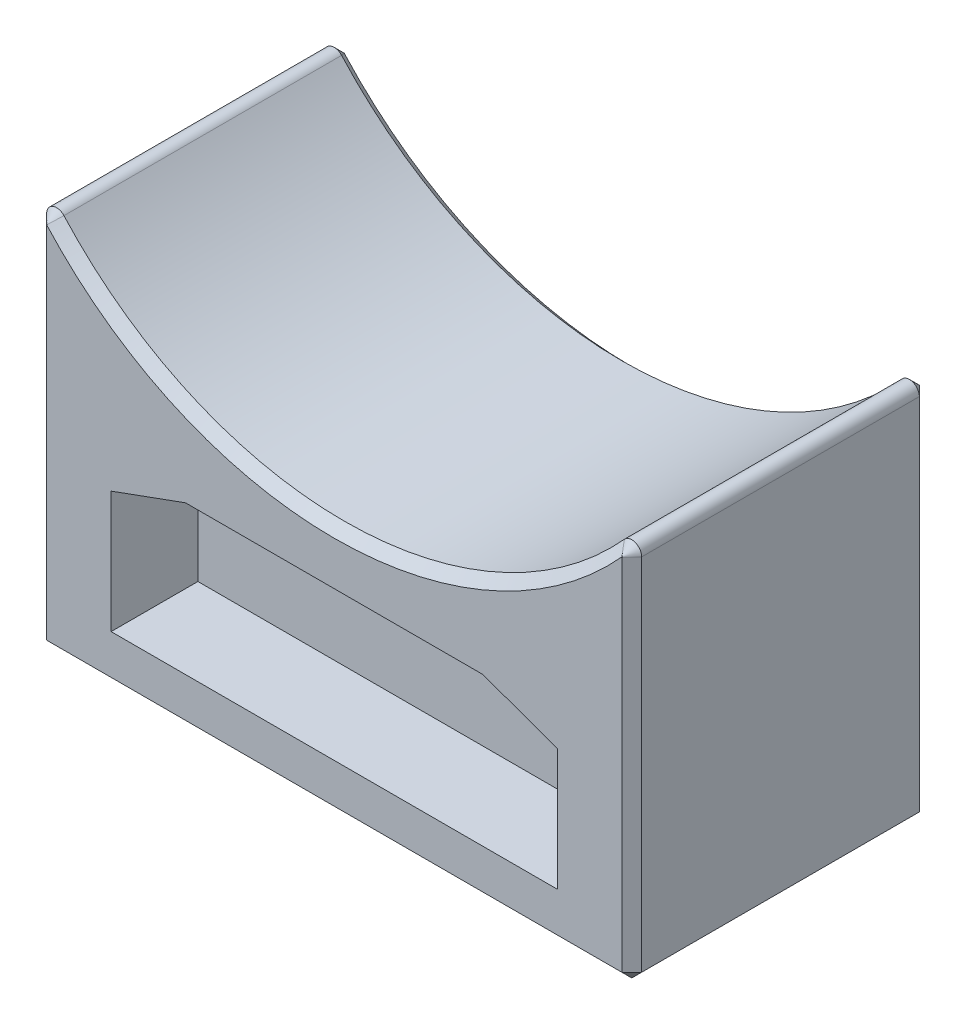
ISO-10303-21;
HEADER;
FILE_DESCRIPTION(('STEP AP214'),'2;1');
FILE_NAME('part.step','',(''),(''),'','','');
FILE_SCHEMA(('AUTOMOTIVE_DESIGN { 1 0 10303 214 1 1 1 1 }'));
ENDSEC;
DATA;
#1=APPLICATION_CONTEXT('core data for automotive mechanical design processes');
#2=APPLICATION_PROTOCOL_DEFINITION('international standard','automotive_design',2000,#1);
#3=PRODUCT_CONTEXT('',#1,'mechanical');
#4=PRODUCT('Part','Part','',(#3));
#5=PRODUCT_RELATED_PRODUCT_CATEGORY('part','',(#4));
#6=PRODUCT_DEFINITION_FORMATION('','',#4);
#7=PRODUCT_DEFINITION_CONTEXT('part definition',#1,'design');
#8=PRODUCT_DEFINITION('design','',#6,#7);
#9=PRODUCT_DEFINITION_SHAPE('','',#8);
#10=(LENGTH_UNIT() NAMED_UNIT(*) SI_UNIT(.MILLI.,.METRE.));
#11=(NAMED_UNIT(*) PLANE_ANGLE_UNIT() SI_UNIT($,.RADIAN.));
#12=(NAMED_UNIT(*) SI_UNIT($,.STERADIAN.) SOLID_ANGLE_UNIT());
#13=UNCERTAINTY_MEASURE_WITH_UNIT(LENGTH_MEASURE(1.E-05),#10,'distance_accuracy_value','');
#14=(GEOMETRIC_REPRESENTATION_CONTEXT(3) GLOBAL_UNCERTAINTY_ASSIGNED_CONTEXT((#13)) GLOBAL_UNIT_ASSIGNED_CONTEXT((#10,
#11,#12)) REPRESENTATION_CONTEXT('',''));
#15=CARTESIAN_POINT('',(0.,0.,0.));
#16=DIRECTION('',(0.,0.,1.));
#17=DIRECTION('',(1.,0.,0.));
#18=AXIS2_PLACEMENT_3D('',#15,#16,#17);
#19=CARTESIAN_POINT('',(0.,0.,60.));
#20=DIRECTION('',(0.,0.,-1.));
#21=DIRECTION('',(-1.,0.,0.));
#22=AXIS2_PLACEMENT_3D('',#19,#20,#21);
#23=PLANE('',#22);
#24=DIRECTION('',(0.,-1.,0.));
#25=VECTOR('',#24,1.);
#26=CARTESIAN_POINT('',(-58.,-127.,60.));
#27=LINE('',#26,#25);
#28=CARTESIAN_POINT('',(-58.,-52.4522640121473,60.));
#29=VERTEX_POINT('',#28);
#30=CARTESIAN_POINT('',(-58.,-125.,60.));
#31=VERTEX_POINT('',#30);
#32=EDGE_CURVE('E327',#29,#31,#27,.T.);
#33=ORIENTED_EDGE('',*,*,#32,.T.);
#34=DIRECTION('',(1.,0.,0.));
#35=VECTOR('',#34,1.);
#36=CARTESIAN_POINT('',(0.,-125.,60.));
#37=LINE('',#36,#35);
#38=CARTESIAN_POINT('',(58.,-125.,60.));
#39=VERTEX_POINT('',#38);
#40=EDGE_CURVE('E329',#31,#39,#37,.T.);
#41=ORIENTED_EDGE('',*,*,#40,.T.);
#42=DIRECTION('',(0.,1.,0.));
#43=VECTOR('',#42,1.);
#44=CARTESIAN_POINT('',(58.,0.,60.));
#45=LINE('',#44,#43);
#46=CARTESIAN_POINT('',(58.,-52.4522640121473,60.));
#47=VERTEX_POINT('',#46);
#48=EDGE_CURVE('E323',#39,#47,#45,.T.);
#49=ORIENTED_EDGE('',*,*,#48,.T.);
#50=CARTESIAN_POINT('',(0.,0.,60.));
#51=DIRECTION('',(0.,0.,-1.));
#52=DIRECTION('',(-1.,0.,0.));
#53=AXIS2_PLACEMENT_3D('',#50,#51,#52);
#54=CIRCLE('',#53,78.2);
#55=EDGE_CURVE('E325',#47,#29,#54,.T.);
#56=ORIENTED_EDGE('',*,*,#55,.T.);
#57=EDGE_LOOP('',(#33,#41,#49,#56));
#58=FACE_BOUND('',#57,.T.);
#59=DIRECTION('',(0.,1.,0.));
#60=VECTOR('',#59,1.);
#61=CARTESIAN_POINT('',(-45.,-117.,60.));
#62=LINE('',#61,#60);
#63=CARTESIAN_POINT('',(-45.,-117.,60.));
#64=VERTEX_POINT('',#63);
#65=CARTESIAN_POINT('',(-45.,-92.4595535139931,60.));
#66=VERTEX_POINT('',#65);
#67=EDGE_CURVE('E224',#64,#66,#62,.T.);
#68=ORIENTED_EDGE('',*,*,#67,.T.);
#69=DIRECTION('',(-0.939692620785907,-0.342020143325673,0.));
#70=VECTOR('',#69,1.);
#71=CARTESIAN_POINT('',(24.4519276681494,-67.181119130377,60.));
#72=LINE('',#71,#70);
#73=CARTESIAN_POINT('',(-30.0000000000001,-87.,60.));
#74=VERTEX_POINT('',#73);
#75=EDGE_CURVE('E51',#66,#74,#72,.F.);
#76=ORIENTED_EDGE('',*,*,#75,.T.);
#77=DIRECTION('',(1.,0.,0.));
#78=VECTOR('',#77,1.);
#79=CARTESIAN_POINT('',(-45.,-87.,60.));
#80=LINE('',#79,#78);
#81=CARTESIAN_POINT('',(30.0000000000001,-87.,60.));
#82=VERTEX_POINT('',#81);
#83=EDGE_CURVE('E229',#74,#82,#80,.T.);
#84=ORIENTED_EDGE('',*,*,#83,.T.);
#85=DIRECTION('',(-0.939692620785907,0.342020143325673,0.));
#86=VECTOR('',#85,1.);
#87=CARTESIAN_POINT('',(-24.4519276681494,-67.181119130377,60.));
#88=LINE('',#87,#86);
#89=CARTESIAN_POINT('',(45.,-92.4595535139931,60.));
#90=VERTEX_POINT('',#89);
#91=EDGE_CURVE('E11',#82,#90,#88,.F.);
#92=ORIENTED_EDGE('',*,*,#91,.T.);
#93=DIRECTION('',(0.,-1.,0.));
#94=VECTOR('',#93,1.);
#95=CARTESIAN_POINT('',(45.,-117.,60.));
#96=LINE('',#95,#94);
#97=CARTESIAN_POINT('',(45.,-117.,60.));
#98=VERTEX_POINT('',#97);
#99=EDGE_CURVE('E231',#90,#98,#96,.T.);
#100=ORIENTED_EDGE('',*,*,#99,.T.);
#101=DIRECTION('',(-1.,0.,0.));
#102=VECTOR('',#101,1.);
#103=CARTESIAN_POINT('',(-45.,-117.,60.));
#104=LINE('',#103,#102);
#105=EDGE_CURVE('E236',#98,#64,#104,.T.);
#106=ORIENTED_EDGE('',*,*,#105,.T.);
#107=EDGE_LOOP('',(#68,#76,#84,#92,#100,#106));
#108=FACE_BOUND('',#107,.T.);
#109=ADVANCED_FACE('F41',(#58,#108),#23,.F.);
#110=CARTESIAN_POINT('',(0.,-127.,60.));
#111=DIRECTION('',(0.,1.,0.));
#112=DIRECTION('',(0.,0.,1.));
#113=AXIS2_PLACEMENT_3D('',#110,#111,#112);
#114=PLANE('',#113);
#115=DIRECTION('',(-1.,0.,0.));
#116=VECTOR('',#115,1.);
#117=CARTESIAN_POINT('',(0.,-127.,58.));
#118=LINE('',#117,#116);
#119=CARTESIAN_POINT('',(58.,-127.,58.));
#120=VERTEX_POINT('',#119);
#121=CARTESIAN_POINT('',(-58.,-127.,58.));
#122=VERTEX_POINT('',#121);
#123=EDGE_CURVE('E280',#120,#122,#118,.T.);
#124=ORIENTED_EDGE('',*,*,#123,.T.);
#125=DIRECTION('',(0.,0.,-1.));
#126=VECTOR('',#125,1.);
#127=CARTESIAN_POINT('',(-58.,-127.,0.));
#128=LINE('',#127,#126);
#129=CARTESIAN_POINT('',(-58.,-127.,1.99999999999999));
#130=VERTEX_POINT('',#129);
#131=EDGE_CURVE('E286',#122,#130,#128,.T.);
#132=ORIENTED_EDGE('',*,*,#131,.T.);
#133=DIRECTION('',(1.,0.,0.));
#134=VECTOR('',#133,1.);
#135=CARTESIAN_POINT('',(60.,-127.,1.99999999999999));
#136=LINE('',#135,#134);
#137=CARTESIAN_POINT('',(58.,-127.,1.99999999999999));
#138=VERTEX_POINT('',#137);
#139=EDGE_CURVE('E284',#130,#138,#136,.T.);
#140=ORIENTED_EDGE('',*,*,#139,.T.);
#141=DIRECTION('',(0.,0.,1.));
#142=VECTOR('',#141,1.);
#143=CARTESIAN_POINT('',(58.,-127.,60.));
#144=LINE('',#143,#142);
#145=EDGE_CURVE('E282',#138,#120,#144,.T.);
#146=ORIENTED_EDGE('',*,*,#145,.T.);
#147=EDGE_LOOP('',(#124,#132,#140,#146));
#148=FACE_BOUND('',#147,.T.);
#149=ADVANCED_FACE('F441',(#148),#114,.F.);
#150=CARTESIAN_POINT('',(60.,-127.,60.));
#151=DIRECTION('',(-1.,0.,0.));
#152=DIRECTION('',(0.,0.,1.));
#153=AXIS2_PLACEMENT_3D('',#150,#151,#152);
#154=PLANE('',#153);
#155=DIRECTION('',(0.,0.,-1.));
#156=VECTOR('',#155,1.);
#157=CARTESIAN_POINT('',(60.,-125.,60.));
#158=LINE('',#157,#156);
#159=CARTESIAN_POINT('',(60.,-125.,58.));
#160=VERTEX_POINT('',#159);
#161=CARTESIAN_POINT('',(60.,-125.,1.99999999999999));
#162=VERTEX_POINT('',#161);
#163=EDGE_CURVE('E319',#160,#162,#158,.T.);
#164=ORIENTED_EDGE('',*,*,#163,.T.);
#165=DIRECTION('',(0.,1.,0.));
#166=VECTOR('',#165,1.);
#167=CARTESIAN_POINT('',(60.,-52.4522640121473,1.99999999999999));
#168=LINE('',#167,#166);
#169=CARTESIAN_POINT('',(60.,-52.4522640121473,1.99999999999999));
#170=VERTEX_POINT('',#169);
#171=EDGE_CURVE('E321',#162,#170,#168,.T.);
#172=ORIENTED_EDGE('',*,*,#171,.T.);
#173=DIRECTION('',(0.,0.,-1.));
#174=VECTOR('',#173,1.);
#175=CARTESIAN_POINT('',(60.,-52.4522640121473,60.));
#176=LINE('',#175,#174);
#177=CARTESIAN_POINT('',(60.,-52.4522640121473,58.));
#178=VERTEX_POINT('',#177);
#179=EDGE_CURVE('E274',#170,#178,#176,.F.);
#180=ORIENTED_EDGE('',*,*,#179,.T.);
#181=DIRECTION('',(0.,-1.,0.));
#182=VECTOR('',#181,1.);
#183=CARTESIAN_POINT('',(60.,-127.,58.));
#184=LINE('',#183,#182);
#185=EDGE_CURVE('E317',#178,#160,#184,.T.);
#186=ORIENTED_EDGE('',*,*,#185,.T.);
#187=EDGE_LOOP('',(#164,#172,#180,#186));
#188=FACE_BOUND('',#187,.T.);
#189=ADVANCED_FACE('F449',(#188),#154,.F.);
#190=CARTESIAN_POINT('',(0.,0.,60.));
#191=DIRECTION('',(0.,0.,-1.));
#192=DIRECTION('',(-1.,0.,0.));
#193=AXIS2_PLACEMENT_3D('',#190,#191,#192);
#194=CYLINDRICAL_SURFACE('',#193,76.2);
#195=DIRECTION('',(0.,0.,-1.));
#196=VECTOR('',#195,1.);
#197=CARTESIAN_POINT('',(56.5166240409207,-51.1107738839594,60.));
#198=LINE('',#197,#196);
#199=CARTESIAN_POINT('',(56.5166240409207,-51.1107738839594,58.));
#200=VERTEX_POINT('',#199);
#201=CARTESIAN_POINT('',(56.5166240409207,-51.1107738839594,1.99999999999999));
#202=VERTEX_POINT('',#201);
#203=EDGE_CURVE('E270',#200,#202,#198,.T.);
#204=ORIENTED_EDGE('',*,*,#203,.T.);
#205=CARTESIAN_POINT('',(0.,0.,1.99999999999999));
#206=DIRECTION('',(0.,0.,-1.));
#207=DIRECTION('',(-1.,0.,0.));
#208=AXIS2_PLACEMENT_3D('',#205,#206,#207);
#209=CIRCLE('',#208,76.2);
#210=CARTESIAN_POINT('',(-56.5166240409207,-51.1107738839594,1.99999999999999));
#211=VERTEX_POINT('',#210);
#212=EDGE_CURVE('E311',#202,#211,#209,.T.);
#213=ORIENTED_EDGE('',*,*,#212,.T.);
#214=DIRECTION('',(0.,0.,-1.));
#215=VECTOR('',#214,1.);
#216=CARTESIAN_POINT('',(-56.5166240409207,-51.1107738839594,60.));
#217=LINE('',#216,#215);
#218=CARTESIAN_POINT('',(-56.5166240409207,-51.1107738839594,58.));
#219=VERTEX_POINT('',#218);
#220=EDGE_CURVE('E267',#211,#219,#217,.F.);
#221=ORIENTED_EDGE('',*,*,#220,.T.);
#222=CARTESIAN_POINT('',(0.,0.,58.));
#223=DIRECTION('',(0.,0.,-1.));
#224=DIRECTION('',(-1.,0.,0.));
#225=AXIS2_PLACEMENT_3D('',#222,#223,#224);
#226=CIRCLE('',#225,76.2);
#227=EDGE_CURVE('E309',#219,#200,#226,.F.);
#228=ORIENTED_EDGE('',*,*,#227,.T.);
#229=EDGE_LOOP('',(#204,#213,#221,#228));
#230=FACE_BOUND('',#229,.T.);
#231=ADVANCED_FACE('F459',(#230),#194,.F.);
#232=CARTESIAN_POINT('',(0.,0.,0.));
#233=DIRECTION('',(0.,0.,-1.));
#234=DIRECTION('',(-1.,0.,0.));
#235=AXIS2_PLACEMENT_3D('',#232,#233,#234);
#236=PLANE('',#235);
#237=DIRECTION('',(0.,1.,0.));
#238=VECTOR('',#237,1.);
#239=CARTESIAN_POINT('',(-45.,-117.,0.));
#240=LINE('',#239,#238);
#241=CARTESIAN_POINT('',(-45.,-117.,0.));
#242=VERTEX_POINT('',#241);
#243=CARTESIAN_POINT('',(-45.,-92.4595535139931,0.));
#244=VERTEX_POINT('',#243);
#245=EDGE_CURVE('E251',#242,#244,#240,.T.);
#246=ORIENTED_EDGE('',*,*,#245,.F.);
#247=DIRECTION('',(-1.,0.,0.));
#248=VECTOR('',#247,1.);
#249=CARTESIAN_POINT('',(-45.,-117.,0.));
#250=LINE('',#249,#248);
#251=CARTESIAN_POINT('',(45.,-117.,0.));
#252=VERTEX_POINT('',#251);
#253=EDGE_CURVE('E245',#252,#242,#250,.T.);
#254=ORIENTED_EDGE('',*,*,#253,.F.);
#255=DIRECTION('',(0.,-1.,0.));
#256=VECTOR('',#255,1.);
#257=CARTESIAN_POINT('',(45.,-117.,0.));
#258=LINE('',#257,#256);
#259=CARTESIAN_POINT('',(45.,-92.4595535139931,0.));
#260=VERTEX_POINT('',#259);
#261=EDGE_CURVE('E258',#260,#252,#258,.T.);
#262=ORIENTED_EDGE('',*,*,#261,.F.);
#263=DIRECTION('',(0.939692620785907,-0.342020143325673,0.));
#264=VECTOR('',#263,1.);
#265=CARTESIAN_POINT('',(45.,-92.4595535139931,0.));
#266=LINE('',#265,#264);
#267=CARTESIAN_POINT('',(30.0000000000001,-87.,0.));
#268=VERTEX_POINT('',#267);
#269=EDGE_CURVE('E401',#260,#268,#266,.F.);
#270=ORIENTED_EDGE('',*,*,#269,.T.);
#271=DIRECTION('',(1.,0.,0.));
#272=VECTOR('',#271,1.);
#273=CARTESIAN_POINT('',(-45.,-87.,0.));
#274=LINE('',#273,#272);
#275=CARTESIAN_POINT('',(-30.0000000000001,-87.,0.));
#276=VERTEX_POINT('',#275);
#277=EDGE_CURVE('E254',#276,#268,#274,.T.);
#278=ORIENTED_EDGE('',*,*,#277,.F.);
#279=DIRECTION('',(0.939692620785907,0.342020143325673,0.));
#280=VECTOR('',#279,1.);
#281=CARTESIAN_POINT('',(-30.0000000000001,-87.,0.));
#282=LINE('',#281,#280);
#283=EDGE_CURVE('E399',#276,#244,#282,.F.);
#284=ORIENTED_EDGE('',*,*,#283,.T.);
#285=EDGE_LOOP('',(#246,#254,#262,#270,#278,#284));
#286=FACE_BOUND('',#285,.T.);
#287=DIRECTION('',(-1.,0.,0.));
#288=VECTOR('',#287,1.);
#289=CARTESIAN_POINT('',(-60.,-125.,0.));
#290=LINE('',#289,#288);
#291=CARTESIAN_POINT('',(58.,-125.,0.));
#292=VERTEX_POINT('',#291);
#293=CARTESIAN_POINT('',(-58.,-125.,0.));
#294=VERTEX_POINT('',#293);
#295=EDGE_CURVE('E304',#292,#294,#290,.T.);
#296=ORIENTED_EDGE('',*,*,#295,.T.);
#297=DIRECTION('',(0.,1.,0.));
#298=VECTOR('',#297,1.);
#299=CARTESIAN_POINT('',(-58.,0.,0.));
#300=LINE('',#299,#298);
#301=CARTESIAN_POINT('',(-58.,-52.4522640121473,0.));
#302=VERTEX_POINT('',#301);
#303=EDGE_CURVE('E306',#294,#302,#300,.T.);
#304=ORIENTED_EDGE('',*,*,#303,.T.);
#305=CARTESIAN_POINT('',(0.,0.,0.));
#306=DIRECTION('',(0.,0.,-1.));
#307=DIRECTION('',(-1.,0.,0.));
#308=AXIS2_PLACEMENT_3D('',#305,#306,#307);
#309=CIRCLE('',#308,78.2);
#310=CARTESIAN_POINT('',(58.,-52.4522640121473,0.));
#311=VERTEX_POINT('',#310);
#312=EDGE_CURVE('E302',#302,#311,#309,.F.);
#313=ORIENTED_EDGE('',*,*,#312,.T.);
#314=DIRECTION('',(0.,-1.,0.));
#315=VECTOR('',#314,1.);
#316=CARTESIAN_POINT('',(58.,-127.,0.));
#317=LINE('',#316,#315);
#318=EDGE_CURVE('E300',#311,#292,#317,.T.);
#319=ORIENTED_EDGE('',*,*,#318,.T.);
#320=EDGE_LOOP('',(#296,#304,#313,#319));
#321=FACE_BOUND('',#320,.T.);
#322=ADVANCED_FACE('F456',(#286,#321),#236,.T.);
#323=CARTESIAN_POINT('',(-60.,-127.,60.));
#324=DIRECTION('',(-1.,0.,0.));
#325=DIRECTION('',(0.,0.,1.));
#326=AXIS2_PLACEMENT_3D('',#323,#324,#325);
#327=PLANE('',#326);
#328=DIRECTION('',(0.,0.,1.));
#329=VECTOR('',#328,1.);
#330=CARTESIAN_POINT('',(-60.,-52.4522640121473,0.));
#331=LINE('',#330,#329);
#332=CARTESIAN_POINT('',(-60.,-52.4522640121473,58.));
#333=VERTEX_POINT('',#332);
#334=CARTESIAN_POINT('',(-60.,-52.4522640121473,1.99999999999999));
#335=VERTEX_POINT('',#334);
#336=EDGE_CURVE('E277',#333,#335,#331,.F.);
#337=ORIENTED_EDGE('',*,*,#336,.T.);
#338=DIRECTION('',(0.,-1.,0.));
#339=VECTOR('',#338,1.);
#340=CARTESIAN_POINT('',(-60.,-127.,1.99999999999999));
#341=LINE('',#340,#339);
#342=CARTESIAN_POINT('',(-60.,-125.,1.99999999999999));
#343=VERTEX_POINT('',#342);
#344=EDGE_CURVE('E294',#335,#343,#341,.T.);
#345=ORIENTED_EDGE('',*,*,#344,.T.);
#346=DIRECTION('',(0.,0.,1.));
#347=VECTOR('',#346,1.);
#348=CARTESIAN_POINT('',(-60.,-125.,60.));
#349=LINE('',#348,#347);
#350=CARTESIAN_POINT('',(-60.,-125.,58.));
#351=VERTEX_POINT('',#350);
#352=EDGE_CURVE('E291',#343,#351,#349,.T.);
#353=ORIENTED_EDGE('',*,*,#352,.T.);
#354=DIRECTION('',(0.,1.,0.));
#355=VECTOR('',#354,1.);
#356=CARTESIAN_POINT('',(-60.,-52.4522640121473,58.));
#357=LINE('',#356,#355);
#358=EDGE_CURVE('E289',#351,#333,#357,.T.);
#359=ORIENTED_EDGE('',*,*,#358,.T.);
#360=EDGE_LOOP('',(#337,#345,#353,#359));
#361=FACE_BOUND('',#360,.T.);
#362=ADVANCED_FACE('F454',(#361),#327,.T.);
#363=CARTESIAN_POINT('',(58.,-52.4522640121473,60.));
#364=DIRECTION('',(0.,0.,-1.));
#365=DIRECTION('',(-1.,0.,0.));
#366=AXIS2_PLACEMENT_3D('',#363,#364,#365);
#367=CYLINDRICAL_SURFACE('',#366,2.);
#368=ORIENTED_EDGE('',*,*,#179,.F.);
#369=CARTESIAN_POINT('',(58.,-52.4522640121473,1.99999999999999));
#370=DIRECTION('',(0.,0.,-1.));
#371=DIRECTION('',(-1.,0.,0.));
#372=AXIS2_PLACEMENT_3D('',#369,#370,#371);
#373=CIRCLE('',#372,2.);
#374=EDGE_CURVE('E315',#170,#202,#373,.F.);
#375=ORIENTED_EDGE('',*,*,#374,.T.);
#376=ORIENTED_EDGE('',*,*,#203,.F.);
#377=CARTESIAN_POINT('',(58.,-52.4522640121473,58.));
#378=DIRECTION('',(0.,0.,-1.));
#379=DIRECTION('',(-1.,0.,0.));
#380=AXIS2_PLACEMENT_3D('',#377,#378,#379);
#381=CIRCLE('',#380,2.);
#382=EDGE_CURVE('E313',#200,#178,#381,.T.);
#383=ORIENTED_EDGE('',*,*,#382,.T.);
#384=EDGE_LOOP('',(#368,#375,#376,#383));
#385=FACE_BOUND('',#384,.T.);
#386=ADVANCED_FACE('F467',(#385),#367,.T.);
#387=CARTESIAN_POINT('',(-58.,-52.4522640121473,60.));
#388=DIRECTION('',(0.,0.,-1.));
#389=DIRECTION('',(-1.,0.,0.));
#390=AXIS2_PLACEMENT_3D('',#387,#388,#389);
#391=CYLINDRICAL_SURFACE('',#390,2.);
#392=ORIENTED_EDGE('',*,*,#220,.F.);
#393=CARTESIAN_POINT('',(-58.,-52.4522640121473,1.99999999999999));
#394=DIRECTION('',(0.,0.,-1.));
#395=DIRECTION('',(-1.,0.,0.));
#396=AXIS2_PLACEMENT_3D('',#393,#394,#395);
#397=CIRCLE('',#396,2.);
#398=EDGE_CURVE('E298',#211,#335,#397,.F.);
#399=ORIENTED_EDGE('',*,*,#398,.T.);
#400=ORIENTED_EDGE('',*,*,#336,.F.);
#401=CARTESIAN_POINT('',(-58.,-52.4522640121473,58.));
#402=DIRECTION('',(0.,0.,-1.));
#403=DIRECTION('',(-1.,0.,0.));
#404=AXIS2_PLACEMENT_3D('',#401,#402,#403);
#405=CIRCLE('',#404,2.);
#406=EDGE_CURVE('E296',#333,#219,#405,.T.);
#407=ORIENTED_EDGE('',*,*,#406,.T.);
#408=EDGE_LOOP('',(#392,#399,#400,#407));
#409=FACE_BOUND('',#408,.T.);
#410=ADVANCED_FACE('F470',(#409),#391,.T.);
#411=CARTESIAN_POINT('',(58.,-52.4522640121473,58.));
#412=DIRECTION('',(0.,0.,-1.));
#413=DIRECTION('',(-1.,0.,0.));
#414=AXIS2_PLACEMENT_3D('',#411,#412,#413);
#415=CONICAL_SURFACE('',#414,1.99999999999999,0.785398163397448);
#416=DIRECTION('',(-0.707106781186547,0.,0.707106781186547));
#417=VECTOR('',#416,1.);
#418=CARTESIAN_POINT('',(60.,-52.4522640121473,58.));
#419=LINE('',#418,#417);
#420=EDGE_CURVE('E382',#178,#47,#419,.T.);
#421=ORIENTED_EDGE('',*,*,#420,.F.);
#422=ORIENTED_EDGE('',*,*,#382,.F.);
#423=DIRECTION('',(-0.524452599857031,0.47428838326824,-0.707106781186548));
#424=VECTOR('',#423,1.);
#425=CARTESIAN_POINT('',(58.,-52.4522640121473,60.));
#426=LINE('',#425,#424);
#427=EDGE_CURVE('E271',#47,#200,#426,.T.);
#428=ORIENTED_EDGE('',*,*,#427,.F.);
#429=EDGE_LOOP('',(#421,#422,#428));
#430=FACE_BOUND('',#429,.T.);
#431=ADVANCED_FACE('F474',(#430),#415,.T.);
#432=CARTESIAN_POINT('',(58.,-52.4522640121473,1.99999999999999));
#433=DIRECTION('',(0.,0.,1.));
#434=DIRECTION('',(1.,0.,0.));
#435=AXIS2_PLACEMENT_3D('',#432,#433,#434);
#436=CONICAL_SURFACE('',#435,1.99999999999999,0.785398163397448);
#437=DIRECTION('',(0.524452599857031,-0.47428838326824,-0.707106781186548));
#438=VECTOR('',#437,1.);
#439=CARTESIAN_POINT('',(56.5166240409207,-51.1107738839594,1.99999999999999));
#440=LINE('',#439,#438);
#441=EDGE_CURVE('E376',#202,#311,#440,.T.);
#442=ORIENTED_EDGE('',*,*,#441,.F.);
#443=ORIENTED_EDGE('',*,*,#374,.F.);
#444=DIRECTION('',(0.707106781186547,0.,0.707106781186547));
#445=VECTOR('',#444,1.);
#446=CARTESIAN_POINT('',(58.,-52.4522640121473,0.));
#447=LINE('',#446,#445);
#448=EDGE_CURVE('E379',#311,#170,#447,.T.);
#449=ORIENTED_EDGE('',*,*,#448,.F.);
#450=EDGE_LOOP('',(#442,#443,#449));
#451=FACE_BOUND('',#450,.T.);
#452=ADVANCED_FACE('F590',(#451),#436,.T.);
#453=CARTESIAN_POINT('',(0.,0.,60.));
#454=DIRECTION('',(0.,0.,1.));
#455=DIRECTION('',(1.,0.,0.));
#456=AXIS2_PLACEMENT_3D('',#453,#454,#455);
#457=CONICAL_SURFACE('',#456,78.2,0.785398163397448);
#458=ORIENTED_EDGE('',*,*,#427,.T.);
#459=ORIENTED_EDGE('',*,*,#227,.F.);
#460=DIRECTION('',(0.52445259985703,0.474288383268242,-0.707106781186547));
#461=VECTOR('',#460,1.);
#462=CARTESIAN_POINT('',(-58.,-52.4522640121473,60.));
#463=LINE('',#462,#461);
#464=EDGE_CURVE('E373',#29,#219,#463,.T.);
#465=ORIENTED_EDGE('',*,*,#464,.F.);
#466=ORIENTED_EDGE('',*,*,#55,.F.);
#467=EDGE_LOOP('',(#458,#459,#465,#466));
#468=FACE_BOUND('',#467,.T.);
#469=ADVANCED_FACE('F583',(#468),#457,.F.);
#470=CARTESIAN_POINT('',(58.,0.,60.));
#471=DIRECTION('',(-0.707106781186547,0.,-0.707106781186547));
#472=DIRECTION('',(0.,1.,0.));
#473=AXIS2_PLACEMENT_3D('',#470,#471,#472);
#474=PLANE('',#473);
#475=ORIENTED_EDGE('',*,*,#420,.T.);
#476=ORIENTED_EDGE('',*,*,#48,.F.);
#477=DIRECTION('',(0.707106781186548,0.,-0.707106781186548));
#478=VECTOR('',#477,1.);
#479=CARTESIAN_POINT('',(59.,-125.,59.));
#480=LINE('',#479,#478);
#481=EDGE_CURVE('E370',#160,#39,#480,.F.);
#482=ORIENTED_EDGE('',*,*,#481,.F.);
#483=ORIENTED_EDGE('',*,*,#185,.F.);
#484=EDGE_LOOP('',(#475,#476,#482,#483));
#485=FACE_BOUND('',#484,.T.);
#486=ADVANCED_FACE('F576',(#485),#474,.F.);
#487=CARTESIAN_POINT('',(60.,-125.,60.));
#488=DIRECTION('',(-0.707106781186545,0.70710678118655,0.));
#489=DIRECTION('',(0.,0.,-1.));
#490=AXIS2_PLACEMENT_3D('',#487,#488,#489);
#491=PLANE('',#490);
#492=DIRECTION('',(0.70710678118655,0.707106781186545,0.));
#493=VECTOR('',#492,1.);
#494=CARTESIAN_POINT('',(58.,-127.,1.99999999999999));
#495=LINE('',#494,#493);
#496=EDGE_CURVE('E364',#162,#138,#495,.F.);
#497=ORIENTED_EDGE('',*,*,#496,.F.);
#498=ORIENTED_EDGE('',*,*,#163,.F.);
#499=DIRECTION('',(-0.70710678118655,-0.707106781186545,0.));
#500=VECTOR('',#499,1.);
#501=CARTESIAN_POINT('',(58.,-127.,58.));
#502=LINE('',#501,#500);
#503=EDGE_CURVE('E367',#120,#160,#502,.F.);
#504=ORIENTED_EDGE('',*,*,#503,.F.);
#505=ORIENTED_EDGE('',*,*,#145,.F.);
#506=EDGE_LOOP('',(#497,#498,#504,#505));
#507=FACE_BOUND('',#506,.T.);
#508=ADVANCED_FACE('F569',(#507),#491,.F.);
#509=CARTESIAN_POINT('',(60.,-127.,1.99999999999999));
#510=DIRECTION('',(0.707106781186547,0.,-0.707106781186547));
#511=DIRECTION('',(0.,-1.,0.));
#512=AXIS2_PLACEMENT_3D('',#509,#510,#511);
#513=PLANE('',#512);
#514=ORIENTED_EDGE('',*,*,#448,.T.);
#515=ORIENTED_EDGE('',*,*,#171,.F.);
#516=DIRECTION('',(0.707106781186548,0.,0.707106781186548));
#517=VECTOR('',#516,1.);
#518=CARTESIAN_POINT('',(59.,-125.,0.999999999999994));
#519=LINE('',#518,#517);
#520=EDGE_CURVE('E361',#292,#162,#519,.T.);
#521=ORIENTED_EDGE('',*,*,#520,.F.);
#522=ORIENTED_EDGE('',*,*,#318,.F.);
#523=EDGE_LOOP('',(#514,#515,#521,#522));
#524=FACE_BOUND('',#523,.T.);
#525=ADVANCED_FACE('F562',(#524),#513,.T.);
#526=CARTESIAN_POINT('',(0.,0.,1.99999999999999));
#527=DIRECTION('',(0.,0.,-1.));
#528=DIRECTION('',(-1.,0.,0.));
#529=AXIS2_PLACEMENT_3D('',#526,#527,#528);
#530=CONICAL_SURFACE('',#529,76.2,0.785398163397448);
#531=ORIENTED_EDGE('',*,*,#441,.T.);
#532=ORIENTED_EDGE('',*,*,#312,.F.);
#533=DIRECTION('',(-0.52445259985703,-0.474288383268242,-0.707106781186547));
#534=VECTOR('',#533,1.);
#535=CARTESIAN_POINT('',(-56.5166240409207,-51.1107738839594,1.99999999999999));
#536=LINE('',#535,#534);
#537=EDGE_CURVE('E358',#211,#302,#536,.T.);
#538=ORIENTED_EDGE('',*,*,#537,.F.);
#539=ORIENTED_EDGE('',*,*,#212,.F.);
#540=EDGE_LOOP('',(#531,#532,#538,#539));
#541=FACE_BOUND('',#540,.T.);
#542=ADVANCED_FACE('F555',(#541),#530,.F.);
#543=CARTESIAN_POINT('',(-58.,-52.4522640121473,58.));
#544=DIRECTION('',(0.,0.,-1.));
#545=DIRECTION('',(-1.,0.,0.));
#546=AXIS2_PLACEMENT_3D('',#543,#544,#545);
#547=CONICAL_SURFACE('',#546,1.99999999999999,0.785398163397448);
#548=ORIENTED_EDGE('',*,*,#464,.T.);
#549=ORIENTED_EDGE('',*,*,#406,.F.);
#550=DIRECTION('',(-0.707106781186547,0.,-0.707106781186547));
#551=VECTOR('',#550,1.);
#552=CARTESIAN_POINT('',(-58.,-52.4522640121473,60.));
#553=LINE('',#552,#551);
#554=EDGE_CURVE('E355',#29,#333,#553,.T.);
#555=ORIENTED_EDGE('',*,*,#554,.F.);
#556=EDGE_LOOP('',(#548,#549,#555));
#557=FACE_BOUND('',#556,.T.);
#558=ADVANCED_FACE('F548',(#557),#547,.T.);
#559=CARTESIAN_POINT('',(58.,-127.,58.));
#560=DIRECTION('',(0.577350269189625,-0.577350269189629,0.577350269189625));
#561=DIRECTION('',(0.,-0.707106781186545,-0.70710678118655));
#562=AXIS2_PLACEMENT_3D('',#559,#560,#561);
#563=PLANE('',#562);
#564=ORIENTED_EDGE('',*,*,#503,.T.);
#565=ORIENTED_EDGE('',*,*,#481,.T.);
#566=DIRECTION('',(0.,0.707106781186545,0.70710678118655));
#567=VECTOR('',#566,1.);
#568=CARTESIAN_POINT('',(58.,-127.,58.));
#569=LINE('',#568,#567);
#570=EDGE_CURVE('E353',#120,#39,#569,.T.);
#571=ORIENTED_EDGE('',*,*,#570,.F.);
#572=EDGE_LOOP('',(#564,#565,#571));
#573=FACE_BOUND('',#572,.T.);
#574=ADVANCED_FACE('F541',(#573),#563,.T.);
#575=CARTESIAN_POINT('',(58.,-127.,1.99999999999999));
#576=DIRECTION('',(0.577350269189625,-0.577350269189629,-0.577350269189625));
#577=DIRECTION('',(0.,0.707106781186545,-0.70710678118655));
#578=AXIS2_PLACEMENT_3D('',#575,#576,#577);
#579=PLANE('',#578);
#580=ORIENTED_EDGE('',*,*,#520,.T.);
#581=ORIENTED_EDGE('',*,*,#496,.T.);
#582=DIRECTION('',(0.,0.707106781186545,-0.70710678118655));
#583=VECTOR('',#582,1.);
#584=CARTESIAN_POINT('',(58.,-127.,1.99999999999999));
#585=LINE('',#584,#583);
#586=EDGE_CURVE('E350',#292,#138,#585,.F.);
#587=ORIENTED_EDGE('',*,*,#586,.F.);
#588=EDGE_LOOP('',(#580,#581,#587));
#589=FACE_BOUND('',#588,.T.);
#590=ADVANCED_FACE('F534',(#589),#579,.T.);
#591=CARTESIAN_POINT('',(-58.,-52.4522640121473,1.99999999999999));
#592=DIRECTION('',(0.,0.,1.));
#593=DIRECTION('',(1.,0.,0.));
#594=AXIS2_PLACEMENT_3D('',#591,#592,#593);
#595=CONICAL_SURFACE('',#594,1.99999999999999,0.785398163397448);
#596=ORIENTED_EDGE('',*,*,#398,.F.);
#597=ORIENTED_EDGE('',*,*,#537,.T.);
#598=DIRECTION('',(0.707106781186547,0.,-0.707106781186547));
#599=VECTOR('',#598,1.);
#600=CARTESIAN_POINT('',(-60.,-52.4522640121473,1.99999999999999));
#601=LINE('',#600,#599);
#602=EDGE_CURVE('E348',#335,#302,#601,.T.);
#603=ORIENTED_EDGE('',*,*,#602,.F.);
#604=EDGE_LOOP('',(#596,#597,#603));
#605=FACE_BOUND('',#604,.T.);
#606=ADVANCED_FACE('F527',(#605),#595,.T.);
#607=CARTESIAN_POINT('',(-60.,-127.,58.));
#608=DIRECTION('',(-0.707106781186547,0.,0.707106781186547));
#609=DIRECTION('',(0.,-1.,0.));
#610=AXIS2_PLACEMENT_3D('',#607,#608,#609);
#611=PLANE('',#610);
#612=ORIENTED_EDGE('',*,*,#554,.T.);
#613=ORIENTED_EDGE('',*,*,#358,.F.);
#614=DIRECTION('',(-0.707106781186548,0.,-0.707106781186548));
#615=VECTOR('',#614,1.);
#616=CARTESIAN_POINT('',(-60.,-125.,58.));
#617=LINE('',#616,#615);
#618=EDGE_CURVE('E345',#31,#351,#617,.T.);
#619=ORIENTED_EDGE('',*,*,#618,.F.);
#620=ORIENTED_EDGE('',*,*,#32,.F.);
#621=EDGE_LOOP('',(#612,#613,#619,#620));
#622=FACE_BOUND('',#621,.T.);
#623=ADVANCED_FACE('F520',(#622),#611,.T.);
#624=CARTESIAN_POINT('',(0.,-125.,60.));
#625=DIRECTION('',(0.,0.70710678118655,-0.707106781186545));
#626=DIRECTION('',(1.,0.,0.));
#627=AXIS2_PLACEMENT_3D('',#624,#625,#626);
#628=PLANE('',#627);
#629=ORIENTED_EDGE('',*,*,#570,.T.);
#630=ORIENTED_EDGE('',*,*,#40,.F.);
#631=DIRECTION('',(0.,-0.707106781186545,-0.70710678118655));
#632=VECTOR('',#631,1.);
#633=CARTESIAN_POINT('',(-58.,-126.,59.));
#634=LINE('',#633,#632);
#635=EDGE_CURVE('E342',#122,#31,#634,.F.);
#636=ORIENTED_EDGE('',*,*,#635,.F.);
#637=ORIENTED_EDGE('',*,*,#123,.F.);
#638=EDGE_LOOP('',(#629,#630,#636,#637));
#639=FACE_BOUND('',#638,.T.);
#640=ADVANCED_FACE('F513',(#639),#628,.F.);
#641=CARTESIAN_POINT('',(0.,-127.,1.99999999999999));
#642=DIRECTION('',(0.,-0.70710678118655,-0.707106781186545));
#643=DIRECTION('',(-1.,0.,0.));
#644=AXIS2_PLACEMENT_3D('',#641,#642,#643);
#645=PLANE('',#644);
#646=ORIENTED_EDGE('',*,*,#586,.T.);
#647=ORIENTED_EDGE('',*,*,#139,.F.);
#648=DIRECTION('',(0.,-0.707106781186545,0.70710678118655));
#649=VECTOR('',#648,1.);
#650=CARTESIAN_POINT('',(-58.,-127.,1.99999999999999));
#651=LINE('',#650,#649);
#652=EDGE_CURVE('E339',#294,#130,#651,.T.);
#653=ORIENTED_EDGE('',*,*,#652,.F.);
#654=ORIENTED_EDGE('',*,*,#295,.F.);
#655=EDGE_LOOP('',(#646,#647,#653,#654));
#656=FACE_BOUND('',#655,.T.);
#657=ADVANCED_FACE('F506',(#656),#645,.T.);
#658=CARTESIAN_POINT('',(-58.,0.,0.));
#659=DIRECTION('',(0.707106781186547,0.,0.707106781186547));
#660=DIRECTION('',(0.,1.,0.));
#661=AXIS2_PLACEMENT_3D('',#658,#659,#660);
#662=PLANE('',#661);
#663=ORIENTED_EDGE('',*,*,#602,.T.);
#664=ORIENTED_EDGE('',*,*,#303,.F.);
#665=DIRECTION('',(-0.707106781186548,0.,0.707106781186548));
#666=VECTOR('',#665,1.);
#667=CARTESIAN_POINT('',(-59.,-125.,0.999999999999994));
#668=LINE('',#667,#666);
#669=EDGE_CURVE('E336',#343,#294,#668,.F.);
#670=ORIENTED_EDGE('',*,*,#669,.F.);
#671=ORIENTED_EDGE('',*,*,#344,.F.);
#672=EDGE_LOOP('',(#663,#664,#670,#671));
#673=FACE_BOUND('',#672,.T.);
#674=ADVANCED_FACE('F499',(#673),#662,.F.);
#675=CARTESIAN_POINT('',(-60.,-125.,58.));
#676=DIRECTION('',(-0.577350269189625,-0.577350269189629,0.577350269189625));
#677=DIRECTION('',(0.,-0.707106781186545,-0.70710678118655));
#678=AXIS2_PLACEMENT_3D('',#675,#676,#677);
#679=PLANE('',#678);
#680=ORIENTED_EDGE('',*,*,#635,.T.);
#681=ORIENTED_EDGE('',*,*,#618,.T.);
#682=DIRECTION('',(0.70710678118655,-0.707106781186545,0.));
#683=VECTOR('',#682,1.);
#684=CARTESIAN_POINT('',(-60.,-125.,58.));
#685=LINE('',#684,#683);
#686=EDGE_CURVE('E334',#122,#351,#685,.F.);
#687=ORIENTED_EDGE('',*,*,#686,.F.);
#688=EDGE_LOOP('',(#680,#681,#687));
#689=FACE_BOUND('',#688,.T.);
#690=ADVANCED_FACE('F492',(#689),#679,.T.);
#691=CARTESIAN_POINT('',(-58.,-127.,1.99999999999999));
#692=DIRECTION('',(-0.577350269189625,-0.577350269189629,-0.577350269189625));
#693=DIRECTION('',(0.,0.707106781186545,-0.70710678118655));
#694=AXIS2_PLACEMENT_3D('',#691,#692,#693);
#695=PLANE('',#694);
#696=ORIENTED_EDGE('',*,*,#669,.T.);
#697=ORIENTED_EDGE('',*,*,#652,.T.);
#698=DIRECTION('',(-0.70710678118655,0.707106781186545,0.));
#699=VECTOR('',#698,1.);
#700=CARTESIAN_POINT('',(-58.,-127.,1.99999999999999));
#701=LINE('',#700,#699);
#702=EDGE_CURVE('E264',#343,#130,#701,.F.);
#703=ORIENTED_EDGE('',*,*,#702,.F.);
#704=EDGE_LOOP('',(#696,#697,#703));
#705=FACE_BOUND('',#704,.T.);
#706=ADVANCED_FACE('F485',(#705),#695,.T.);
#707=CARTESIAN_POINT('',(-58.,-127.,60.));
#708=DIRECTION('',(-0.707106781186545,-0.70710678118655,0.));
#709=DIRECTION('',(0.,0.,1.));
#710=AXIS2_PLACEMENT_3D('',#707,#708,#709);
#711=PLANE('',#710);
#712=ORIENTED_EDGE('',*,*,#686,.T.);
#713=ORIENTED_EDGE('',*,*,#352,.F.);
#714=ORIENTED_EDGE('',*,*,#702,.T.);
#715=ORIENTED_EDGE('',*,*,#131,.F.);
#716=EDGE_LOOP('',(#712,#713,#714,#715));
#717=FACE_BOUND('',#716,.T.);
#718=ADVANCED_FACE('F477',(#717),#711,.T.);
#719=CARTESIAN_POINT('',(-45.,-117.,17.5));
#720=DIRECTION('',(-1.,0.,0.));
#721=DIRECTION('',(0.,0.,1.));
#722=AXIS2_PLACEMENT_3D('',#719,#720,#721);
#723=PLANE('',#722);
#724=ORIENTED_EDGE('',*,*,#245,.T.);
#725=DIRECTION('',(0.,0.,1.));
#726=VECTOR('',#725,1.);
#727=CARTESIAN_POINT('',(-45.,-92.4595535139931,17.5));
#728=LINE('',#727,#726);
#729=CARTESIAN_POINT('',(-45.,-92.4595535139931,17.5));
#730=VERTEX_POINT('',#729);
#731=EDGE_CURVE('E393',#244,#730,#728,.T.);
#732=ORIENTED_EDGE('',*,*,#731,.T.);
#733=DIRECTION('',(0.,1.,0.));
#734=VECTOR('',#733,1.);
#735=CARTESIAN_POINT('',(-45.,-117.,17.5));
#736=LINE('',#735,#734);
#737=CARTESIAN_POINT('',(-45.,-117.,17.5));
#738=VERTEX_POINT('',#737);
#739=EDGE_CURVE('E241',#738,#730,#736,.T.);
#740=ORIENTED_EDGE('',*,*,#739,.F.);
#741=DIRECTION('',(0.,0.,-1.));
#742=VECTOR('',#741,1.);
#743=CARTESIAN_POINT('',(-45.,-117.,17.5));
#744=LINE('',#743,#742);
#745=EDGE_CURVE('E262',#738,#242,#744,.T.);
#746=ORIENTED_EDGE('',*,*,#745,.T.);
#747=EDGE_LOOP('',(#724,#732,#740,#746));
#748=FACE_BOUND('',#747,.T.);
#749=ADVANCED_FACE('F484',(#748),#723,.F.);
#750=CARTESIAN_POINT('',(-45.,-117.,17.5));
#751=DIRECTION('',(0.,-1.,0.));
#752=DIRECTION('',(0.,0.,-1.));
#753=AXIS2_PLACEMENT_3D('',#750,#751,#752);
#754=PLANE('',#753);
#755=ORIENTED_EDGE('',*,*,#253,.T.);
#756=ORIENTED_EDGE('',*,*,#745,.F.);
#757=DIRECTION('',(-1.,0.,0.));
#758=VECTOR('',#757,1.);
#759=CARTESIAN_POINT('',(-45.,-117.,17.5));
#760=LINE('',#759,#758);
#761=CARTESIAN_POINT('',(45.,-117.,17.5));
#762=VERTEX_POINT('',#761);
#763=EDGE_CURVE('E247',#762,#738,#760,.T.);
#764=ORIENTED_EDGE('',*,*,#763,.F.);
#765=DIRECTION('',(0.,0.,-1.));
#766=VECTOR('',#765,1.);
#767=CARTESIAN_POINT('',(45.,-117.,17.5));
#768=LINE('',#767,#766);
#769=EDGE_CURVE('E250',#762,#252,#768,.T.);
#770=ORIENTED_EDGE('',*,*,#769,.T.);
#771=EDGE_LOOP('',(#755,#756,#764,#770));
#772=FACE_BOUND('',#771,.T.);
#773=ADVANCED_FACE('F645',(#772),#754,.F.);
#774=CARTESIAN_POINT('',(45.,-117.,17.5));
#775=DIRECTION('',(1.,0.,0.));
#776=DIRECTION('',(0.,0.,-1.));
#777=AXIS2_PLACEMENT_3D('',#774,#775,#776);
#778=PLANE('',#777);
#779=DIRECTION('',(0.,-1.,0.));
#780=VECTOR('',#779,1.);
#781=CARTESIAN_POINT('',(45.,-117.,17.5));
#782=LINE('',#781,#780);
#783=CARTESIAN_POINT('',(45.,-92.4595535139931,17.5));
#784=VERTEX_POINT('',#783);
#785=EDGE_CURVE('E244',#784,#762,#782,.T.);
#786=ORIENTED_EDGE('',*,*,#785,.F.);
#787=DIRECTION('',(0.,0.,-1.));
#788=VECTOR('',#787,1.);
#789=CARTESIAN_POINT('',(45.,-92.4595535139931,0.));
#790=LINE('',#789,#788);
#791=EDGE_CURVE('E397',#784,#260,#790,.T.);
#792=ORIENTED_EDGE('',*,*,#791,.T.);
#793=ORIENTED_EDGE('',*,*,#261,.T.);
#794=ORIENTED_EDGE('',*,*,#769,.F.);
#795=EDGE_LOOP('',(#786,#792,#793,#794));
#796=FACE_BOUND('',#795,.T.);
#797=ADVANCED_FACE('F649',(#796),#778,.F.);
#798=CARTESIAN_POINT('',(-45.,-87.,17.5));
#799=DIRECTION('',(0.,1.,0.));
#800=DIRECTION('',(0.,0.,1.));
#801=AXIS2_PLACEMENT_3D('',#798,#799,#800);
#802=PLANE('',#801);
#803=DIRECTION('',(-1.,0.,0.));
#804=VECTOR('',#803,1.);
#805=CARTESIAN_POINT('',(-45.,-87.,2.50000000000013));
#806=LINE('',#805,#804);
#807=CARTESIAN_POINT('',(30.0000000000001,-87.,2.50000000000013));
#808=VERTEX_POINT('',#807);
#809=CARTESIAN_POINT('',(-30.0000000000001,-87.,2.50000000000013));
#810=VERTEX_POINT('',#809);
#811=EDGE_CURVE('E388',#808,#810,#806,.T.);
#812=ORIENTED_EDGE('',*,*,#811,.T.);
#813=DIRECTION('',(0.,0.,-1.));
#814=VECTOR('',#813,1.);
#815=CARTESIAN_POINT('',(-30.0000000000001,-87.,0.));
#816=LINE('',#815,#814);
#817=EDGE_CURVE('E390',#810,#276,#816,.T.);
#818=ORIENTED_EDGE('',*,*,#817,.T.);
#819=ORIENTED_EDGE('',*,*,#277,.T.);
#820=DIRECTION('',(0.,0.,1.));
#821=VECTOR('',#820,1.);
#822=CARTESIAN_POINT('',(30.0000000000001,-87.,17.5));
#823=LINE('',#822,#821);
#824=EDGE_CURVE('E332',#268,#808,#823,.T.);
#825=ORIENTED_EDGE('',*,*,#824,.T.);
#826=EDGE_LOOP('',(#812,#818,#819,#825));
#827=FACE_BOUND('',#826,.T.);
#828=ADVANCED_FACE('F624',(#827),#802,.F.);
#829=CARTESIAN_POINT('',(0.,0.,17.5));
#830=DIRECTION('',(0.,0.,-1.));
#831=DIRECTION('',(-1.,0.,0.));
#832=AXIS2_PLACEMENT_3D('',#829,#830,#831);
#833=PLANE('',#832);
#834=ORIENTED_EDGE('',*,*,#739,.T.);
#835=DIRECTION('',(1.,0.,0.));
#836=VECTOR('',#835,1.);
#837=CARTESIAN_POINT('',(0.,-92.4595535139931,17.5));
#838=LINE('',#837,#836);
#839=EDGE_CURVE('E395',#730,#784,#838,.T.);
#840=ORIENTED_EDGE('',*,*,#839,.T.);
#841=ORIENTED_EDGE('',*,*,#785,.T.);
#842=ORIENTED_EDGE('',*,*,#763,.T.);
#843=EDGE_LOOP('',(#834,#840,#841,#842));
#844=FACE_BOUND('',#843,.T.);
#845=ADVANCED_FACE('F619',(#844),#833,.T.);
#846=CARTESIAN_POINT('',(45.,-92.4595535139931,17.5));
#847=DIRECTION('',(-0.342020143325673,-0.939692620785907,0.));
#848=DIRECTION('',(0.,0.,1.));
#849=AXIS2_PLACEMENT_3D('',#846,#847,#848);
#850=PLANE('',#849);
#851=ORIENTED_EDGE('',*,*,#269,.F.);
#852=ORIENTED_EDGE('',*,*,#791,.F.);
#853=DIRECTION('',(0.684791078771735,-0.249243569363958,0.684791078771735));
#854=VECTOR('',#853,1.);
#855=CARTESIAN_POINT('',(23.8977530295589,-84.7789637406183,-3.60224697044106));
#856=LINE('',#855,#854);
#857=EDGE_CURVE('E255',#808,#784,#856,.T.);
#858=ORIENTED_EDGE('',*,*,#857,.F.);
#859=ORIENTED_EDGE('',*,*,#824,.F.);
#860=EDGE_LOOP('',(#851,#852,#858,#859));
#861=FACE_BOUND('',#860,.T.);
#862=ADVANCED_FACE('F614',(#861),#850,.T.);
#863=CARTESIAN_POINT('',(0.,-92.4595535139931,17.5));
#864=DIRECTION('',(0.,0.939692620785907,0.342020143325673));
#865=DIRECTION('',(1.,0.,0.));
#866=AXIS2_PLACEMENT_3D('',#863,#864,#865);
#867=PLANE('',#866);
#868=ORIENTED_EDGE('',*,*,#857,.T.);
#869=ORIENTED_EDGE('',*,*,#839,.F.);
#870=DIRECTION('',(-0.684791078771735,-0.249243569363958,0.684791078771735));
#871=VECTOR('',#870,1.);
#872=CARTESIAN_POINT('',(-37.0340823234804,-89.5601965911249,9.53408232348042));
#873=LINE('',#872,#871);
#874=EDGE_CURVE('E239',#810,#730,#873,.T.);
#875=ORIENTED_EDGE('',*,*,#874,.F.);
#876=ORIENTED_EDGE('',*,*,#811,.F.);
#877=EDGE_LOOP('',(#868,#869,#875,#876));
#878=FACE_BOUND('',#877,.T.);
#879=ADVANCED_FACE('F609',(#878),#867,.F.);
#880=CARTESIAN_POINT('',(-30.0000000000001,-87.,17.5));
#881=DIRECTION('',(0.342020143325673,-0.939692620785907,0.));
#882=DIRECTION('',(0.,0.,1.));
#883=AXIS2_PLACEMENT_3D('',#880,#881,#882);
#884=PLANE('',#883);
#885=ORIENTED_EDGE('',*,*,#874,.T.);
#886=ORIENTED_EDGE('',*,*,#731,.F.);
#887=ORIENTED_EDGE('',*,*,#283,.F.);
#888=ORIENTED_EDGE('',*,*,#817,.F.);
#889=EDGE_LOOP('',(#885,#886,#887,#888));
#890=FACE_BOUND('',#889,.T.);
#891=ADVANCED_FACE('F604',(#890),#884,.T.);
#892=CARTESIAN_POINT('',(-45.,-117.,42.5));
#893=DIRECTION('',(1.,0.,0.));
#894=DIRECTION('',(0.,0.,-1.));
#895=AXIS2_PLACEMENT_3D('',#892,#893,#894);
#896=PLANE('',#895);
#897=DIRECTION('',(0.,1.,0.));
#898=VECTOR('',#897,1.);
#899=CARTESIAN_POINT('',(-45.,-117.,42.5));
#900=LINE('',#899,#898);
#901=CARTESIAN_POINT('',(-45.,-117.,42.5));
#902=VERTEX_POINT('',#901);
#903=CARTESIAN_POINT('',(-45.,-92.4595535139931,42.5));
#904=VERTEX_POINT('',#903);
#905=EDGE_CURVE('E216',#902,#904,#900,.T.);
#906=ORIENTED_EDGE('',*,*,#905,.T.);
#907=DIRECTION('',(0.,0.,1.));
#908=VECTOR('',#907,1.);
#909=CARTESIAN_POINT('',(-45.,-92.4595535139931,60.));
#910=LINE('',#909,#908);
#911=EDGE_CURVE('E403',#904,#66,#910,.T.);
#912=ORIENTED_EDGE('',*,*,#911,.T.);
#913=ORIENTED_EDGE('',*,*,#67,.F.);
#914=DIRECTION('',(0.,0.,1.));
#915=VECTOR('',#914,1.);
#916=CARTESIAN_POINT('',(-45.,-117.,42.5));
#917=LINE('',#916,#915);
#918=EDGE_CURVE('E209',#902,#64,#917,.T.);
#919=ORIENTED_EDGE('',*,*,#918,.F.);
#920=EDGE_LOOP('',(#906,#912,#913,#919));
#921=FACE_BOUND('',#920,.T.);
#922=ADVANCED_FACE('F220',(#921),#896,.T.);
#923=CARTESIAN_POINT('',(-45.,-87.,42.5));
#924=DIRECTION('',(0.,-1.,0.));
#925=DIRECTION('',(0.,0.,-1.));
#926=AXIS2_PLACEMENT_3D('',#923,#924,#925);
#927=PLANE('',#926);
#928=ORIENTED_EDGE('',*,*,#83,.F.);
#929=DIRECTION('',(0.,0.,-1.));
#930=VECTOR('',#929,1.);
#931=CARTESIAN_POINT('',(-30.0000000000001,-87.,42.5));
#932=LINE('',#931,#930);
#933=CARTESIAN_POINT('',(-30.0000000000001,-87.,57.4999999999999));
#934=VERTEX_POINT('',#933);
#935=EDGE_CURVE('E413',#74,#934,#932,.T.);
#936=ORIENTED_EDGE('',*,*,#935,.T.);
#937=DIRECTION('',(1.,0.,0.));
#938=VECTOR('',#937,1.);
#939=CARTESIAN_POINT('',(45.,-87.,57.4999999999999));
#940=LINE('',#939,#938);
#941=CARTESIAN_POINT('',(30.0000000000001,-87.,57.4999999999999));
#942=VERTEX_POINT('',#941);
#943=EDGE_CURVE('E411',#934,#942,#940,.T.);
#944=ORIENTED_EDGE('',*,*,#943,.T.);
#945=DIRECTION('',(0.,0.,1.));
#946=VECTOR('',#945,1.);
#947=CARTESIAN_POINT('',(30.0000000000001,-87.,60.));
#948=LINE('',#947,#946);
#949=EDGE_CURVE('E409',#942,#82,#948,.T.);
#950=ORIENTED_EDGE('',*,*,#949,.T.);
#951=EDGE_LOOP('',(#928,#936,#944,#950));
#952=FACE_BOUND('',#951,.T.);
#953=ADVANCED_FACE('F431',(#952),#927,.T.);
#954=CARTESIAN_POINT('',(45.,-117.,42.5));
#955=DIRECTION('',(-1.,0.,0.));
#956=DIRECTION('',(0.,0.,1.));
#957=AXIS2_PLACEMENT_3D('',#954,#955,#956);
#958=PLANE('',#957);
#959=ORIENTED_EDGE('',*,*,#99,.F.);
#960=DIRECTION('',(0.,0.,-1.));
#961=VECTOR('',#960,1.);
#962=CARTESIAN_POINT('',(45.,-92.4595535139931,42.5));
#963=LINE('',#962,#961);
#964=CARTESIAN_POINT('',(45.,-92.4595535139931,42.5));
#965=VERTEX_POINT('',#964);
#966=EDGE_CURVE('E64',#90,#965,#963,.T.);
#967=ORIENTED_EDGE('',*,*,#966,.T.);
#968=DIRECTION('',(0.,-1.,0.));
#969=VECTOR('',#968,1.);
#970=CARTESIAN_POINT('',(45.,-117.,42.5));
#971=LINE('',#970,#969);
#972=CARTESIAN_POINT('',(45.,-117.,42.5));
#973=VERTEX_POINT('',#972);
#974=EDGE_CURVE('E215',#965,#973,#971,.T.);
#975=ORIENTED_EDGE('',*,*,#974,.T.);
#976=DIRECTION('',(0.,0.,1.));
#977=VECTOR('',#976,1.);
#978=CARTESIAN_POINT('',(45.,-117.,42.5));
#979=LINE('',#978,#977);
#980=EDGE_CURVE('E212',#973,#98,#979,.T.);
#981=ORIENTED_EDGE('',*,*,#980,.T.);
#982=EDGE_LOOP('',(#959,#967,#975,#981));
#983=FACE_BOUND('',#982,.T.);
#984=ADVANCED_FACE('F877',(#983),#958,.T.);
#985=CARTESIAN_POINT('',(-45.,-117.,42.5));
#986=DIRECTION('',(0.,1.,0.));
#987=DIRECTION('',(0.,0.,1.));
#988=AXIS2_PLACEMENT_3D('',#985,#986,#987);
#989=PLANE('',#988);
#990=ORIENTED_EDGE('',*,*,#105,.F.);
#991=ORIENTED_EDGE('',*,*,#980,.F.);
#992=DIRECTION('',(-1.,0.,0.));
#993=VECTOR('',#992,1.);
#994=CARTESIAN_POINT('',(-45.,-117.,42.5));
#995=LINE('',#994,#993);
#996=EDGE_CURVE('E205',#973,#902,#995,.T.);
#997=ORIENTED_EDGE('',*,*,#996,.T.);
#998=ORIENTED_EDGE('',*,*,#918,.T.);
#999=EDGE_LOOP('',(#990,#991,#997,#998));
#1000=FACE_BOUND('',#999,.T.);
#1001=ADVANCED_FACE('F208',(#1000),#989,.T.);
#1002=CARTESIAN_POINT('',(0.,0.,42.5));
#1003=DIRECTION('',(0.,0.,1.));
#1004=DIRECTION('',(-1.,0.,0.));
#1005=AXIS2_PLACEMENT_3D('',#1002,#1003,#1004);
#1006=PLANE('',#1005);
#1007=ORIENTED_EDGE('',*,*,#974,.F.);
#1008=DIRECTION('',(-1.,0.,0.));
#1009=VECTOR('',#1008,1.);
#1010=CARTESIAN_POINT('',(-45.,-92.4595535139931,42.5));
#1011=LINE('',#1010,#1009);
#1012=EDGE_CURVE('E228',#965,#904,#1011,.T.);
#1013=ORIENTED_EDGE('',*,*,#1012,.T.);
#1014=ORIENTED_EDGE('',*,*,#905,.F.);
#1015=ORIENTED_EDGE('',*,*,#996,.F.);
#1016=EDGE_LOOP('',(#1007,#1013,#1014,#1015));
#1017=FACE_BOUND('',#1016,.T.);
#1018=ADVANCED_FACE('F226',(#1017),#1006,.T.);
#1019=CARTESIAN_POINT('',(30.0000000000001,-87.,42.5));
#1020=DIRECTION('',(-0.342020143325673,-0.939692620785907,0.));
#1021=DIRECTION('',(0.,0.,-1.));
#1022=AXIS2_PLACEMENT_3D('',#1019,#1020,#1021);
#1023=PLANE('',#1022);
#1024=ORIENTED_EDGE('',*,*,#91,.F.);
#1025=ORIENTED_EDGE('',*,*,#949,.F.);
#1026=DIRECTION('',(0.684791078771735,-0.249243569363958,-0.684791078771735));
#1027=VECTOR('',#1026,1.);
#1028=CARTESIAN_POINT('',(-5.17041161740171,-74.1990170443753,92.6704116174017));
#1029=LINE('',#1028,#1027);
#1030=EDGE_CURVE('E46',#965,#942,#1029,.F.);
#1031=ORIENTED_EDGE('',*,*,#1030,.F.);
#1032=ORIENTED_EDGE('',*,*,#966,.F.);
#1033=EDGE_LOOP('',(#1024,#1025,#1031,#1032));
#1034=FACE_BOUND('',#1033,.T.);
#1035=ADVANCED_FACE('F44',(#1034),#1023,.T.);
#1036=CARTESIAN_POINT('',(-45.,-87.,57.4999999999999));
#1037=DIRECTION('',(0.,-0.939692620785907,0.342020143325673));
#1038=DIRECTION('',(-1.,0.,0.));
#1039=AXIS2_PLACEMENT_3D('',#1036,#1037,#1038);
#1040=PLANE('',#1039);
#1041=ORIENTED_EDGE('',*,*,#1030,.T.);
#1042=ORIENTED_EDGE('',*,*,#943,.F.);
#1043=DIRECTION('',(-0.684791078771735,-0.249243569363958,-0.684791078771735));
#1044=VECTOR('',#1043,1.);
#1045=CARTESIAN_POINT('',(-45.,-92.4595535139931,42.5));
#1046=LINE('',#1045,#1044);
#1047=EDGE_CURVE('E417',#904,#934,#1046,.F.);
#1048=ORIENTED_EDGE('',*,*,#1047,.F.);
#1049=ORIENTED_EDGE('',*,*,#1012,.F.);
#1050=EDGE_LOOP('',(#1041,#1042,#1048,#1049));
#1051=FACE_BOUND('',#1050,.T.);
#1052=ADVANCED_FACE('F426',(#1051),#1040,.T.);
#1053=CARTESIAN_POINT('',(-45.,-92.4595535139931,42.5));
#1054=DIRECTION('',(0.342020143325673,-0.939692620785907,0.));
#1055=DIRECTION('',(0.,0.,-1.));
#1056=AXIS2_PLACEMENT_3D('',#1053,#1054,#1055);
#1057=PLANE('',#1056);
#1058=ORIENTED_EDGE('',*,*,#1047,.T.);
#1059=ORIENTED_EDGE('',*,*,#935,.F.);
#1060=ORIENTED_EDGE('',*,*,#75,.F.);
#1061=ORIENTED_EDGE('',*,*,#911,.F.);
#1062=EDGE_LOOP('',(#1058,#1059,#1060,#1061));
#1063=FACE_BOUND('',#1062,.T.);
#1064=ADVANCED_FACE('F432',(#1063),#1057,.T.);
#1065=CLOSED_SHELL('',(#109,#149,#189,#231,#322,#362,#386,#410,#431,#452,#469,#486,#508,#525,
#542,#558,#574,#590,#606,#623,#640,#657,#674,#690,#706,#718,#749,#773,#797,#828,#845,#862,#879,
#891,#922,#953,#984,#1001,#1018,#1035,#1052,#1064));
#1066=MANIFOLD_SOLID_BREP('B2',#1065);
#1067=ADVANCED_BREP_SHAPE_REPRESENTATION('',(#18,#1066),#14);
#1068=SHAPE_DEFINITION_REPRESENTATION(#9,#1067);
ENDSEC;
END-ISO-10303-21;
